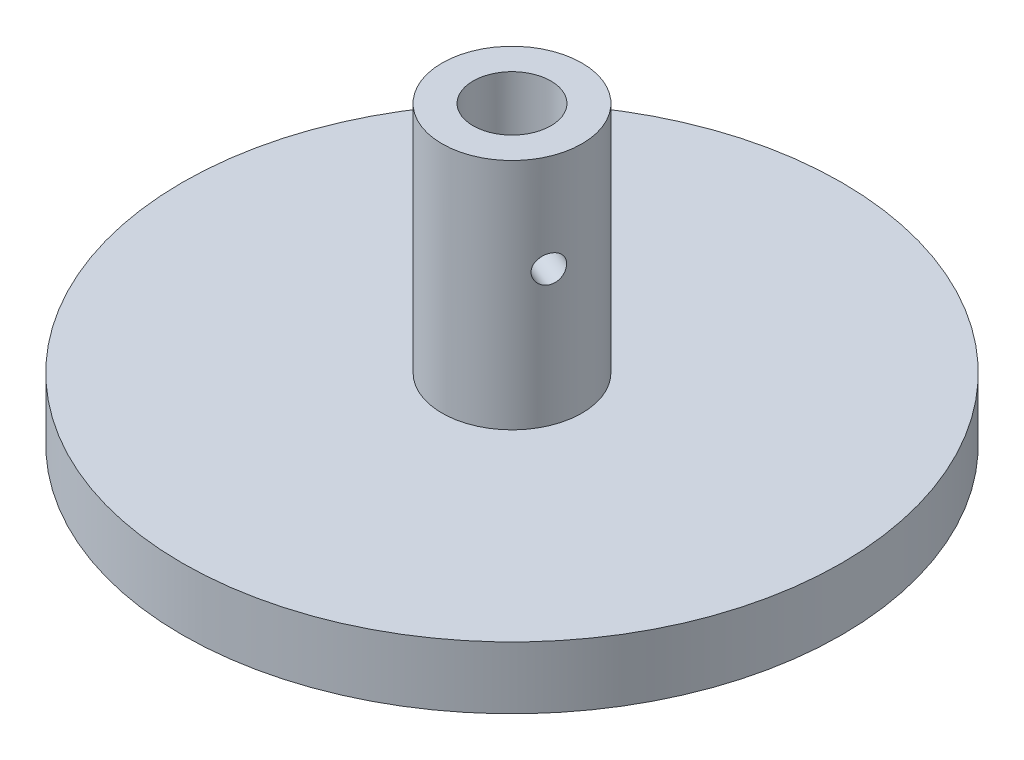
ISO-10303-21;
HEADER;
FILE_DESCRIPTION(('STEP AP214'),'2;1');
FILE_NAME('part.step','',(''),(''),'','','');
FILE_SCHEMA(('AUTOMOTIVE_DESIGN { 1 0 10303 214 1 1 1 1 }'));
ENDSEC;
DATA;
#1=APPLICATION_CONTEXT('core data for automotive mechanical design processes');
#2=APPLICATION_PROTOCOL_DEFINITION('international standard','automotive_design',2000,#1);
#3=PRODUCT_CONTEXT('',#1,'mechanical');
#4=PRODUCT('Part','Part','',(#3));
#5=PRODUCT_RELATED_PRODUCT_CATEGORY('part','',(#4));
#6=PRODUCT_DEFINITION_FORMATION('','',#4);
#7=PRODUCT_DEFINITION_CONTEXT('part definition',#1,'design');
#8=PRODUCT_DEFINITION('design','',#6,#7);
#9=PRODUCT_DEFINITION_SHAPE('','',#8);
#10=(LENGTH_UNIT() NAMED_UNIT(*) SI_UNIT(.MILLI.,.METRE.));
#11=(NAMED_UNIT(*) PLANE_ANGLE_UNIT() SI_UNIT($,.RADIAN.));
#12=(NAMED_UNIT(*) SI_UNIT($,.STERADIAN.) SOLID_ANGLE_UNIT());
#13=UNCERTAINTY_MEASURE_WITH_UNIT(LENGTH_MEASURE(1.E-05),#10,'distance_accuracy_value','');
#14=(GEOMETRIC_REPRESENTATION_CONTEXT(3) GLOBAL_UNCERTAINTY_ASSIGNED_CONTEXT((#13)) GLOBAL_UNIT_ASSIGNED_CONTEXT((#10,
#11,#12)) REPRESENTATION_CONTEXT('',''));
#15=CARTESIAN_POINT('',(0.,0.,0.));
#16=DIRECTION('',(0.,0.,1.));
#17=DIRECTION('',(1.,0.,0.));
#18=AXIS2_PLACEMENT_3D('',#15,#16,#17);
#19=CARTESIAN_POINT('',(-10.4544123734238,15.,0.));
#20=DIRECTION('',(0.,1.,0.));
#21=DIRECTION('',(0.,0.,1.));
#22=AXIS2_PLACEMENT_3D('',#19,#20,#21);
#23=PLANE('',#22);
#24=CARTESIAN_POINT('',(-10.4544123734238,15.,0.));
#25=DIRECTION('',(0.,1.,0.));
#26=DIRECTION('',(0.,0.,1.));
#27=AXIS2_PLACEMENT_3D('',#24,#25,#26);
#28=CIRCLE('',#27,4.5);
#29=CARTESIAN_POINT('',(-10.4544123734238,15.,4.5));
#30=VERTEX_POINT('',#29);
#31=EDGE_CURVE('E45',#30,#30,#28,.T.);
#32=ORIENTED_EDGE('',*,*,#31,.T.);
#33=EDGE_LOOP('',(#32));
#34=FACE_BOUND('',#33,.T.);
#35=CARTESIAN_POINT('',(-10.4544123734238,15.,0.));
#36=DIRECTION('',(0.,1.,0.));
#37=DIRECTION('',(0.,0.,1.));
#38=AXIS2_PLACEMENT_3D('',#35,#36,#37);
#39=CIRCLE('',#38,2.5);
#40=CARTESIAN_POINT('',(-10.4544123734238,15.,2.5));
#41=VERTEX_POINT('',#40);
#42=EDGE_CURVE('E49',#41,#41,#39,.T.);
#43=ORIENTED_EDGE('',*,*,#42,.F.);
#44=EDGE_LOOP('',(#43));
#45=FACE_BOUND('',#44,.T.);
#46=ADVANCED_FACE('F33',(#34,#45),#23,.T.);
#47=CARTESIAN_POINT('',(-10.4544123734238,15.,0.));
#48=DIRECTION('',(0.,-1.,0.));
#49=DIRECTION('',(0.,0.,-1.));
#50=AXIS2_PLACEMENT_3D('',#47,#48,#49);
#51=CYLINDRICAL_SURFACE('',#50,4.5);
#52=CARTESIAN_POINT('',(-6.71996057700668,8.72075334129941,2.51075083993555));
#53=CARTESIAN_POINT('',(-6.71995898771326,8.7694013811557,2.51074952122096));
#54=CARTESIAN_POINT('',(-6.71763952591937,8.8180727787025,2.50730911010159));
#55=CARTESIAN_POINT('',(-6.70849299009468,8.91404071127,2.49362250293919));
#56=CARTESIAN_POINT('',(-6.70166221127065,8.96133608291085,2.48337071319991));
#57=CARTESIAN_POINT('',(-6.68389666340696,9.05314959594451,2.45631253779294));
#58=CARTESIAN_POINT('',(-6.67296585936796,9.09767037220572,2.43951248412508));
#59=CARTESIAN_POINT('',(-6.64759950822875,9.18277015626844,2.39973534935751));
#60=CARTESIAN_POINT('',(-6.63316419182252,9.22334942328437,2.37675867483988));
#61=CARTESIAN_POINT('',(-6.60133597893731,9.29995952240175,2.32480940097412));
#62=CARTESIAN_POINT('',(-6.58390969201148,9.33592997603029,2.29576820468331));
#63=CARTESIAN_POINT('',(-6.54707149689319,9.40177474077911,2.23249300564404));
#64=CARTESIAN_POINT('',(-6.52765945369142,9.43164863698725,2.19825864974204));
#65=CARTESIAN_POINT('',(-6.4875692384146,9.48468525360256,2.12506662096391));
#66=CARTESIAN_POINT('',(-6.46688197162936,9.50779079895585,2.08607244097986));
#67=CARTESIAN_POINT('',(-6.42528306400736,9.54626615345794,2.00454695902164));
#68=CARTESIAN_POINT('',(-6.40437144318208,9.56163664677908,1.9620159702693));
#69=CARTESIAN_POINT('',(-6.3634110668419,9.5840181917506,1.87509644477165));
#70=CARTESIAN_POINT('',(-6.34335480195175,9.59113112404389,1.83073769569623));
#71=CARTESIAN_POINT('',(-6.3045220206221,9.59711331096889,1.74092009763115));
#72=CARTESIAN_POINT('',(-6.28574538750324,9.59598331822459,1.69546134945514));
#73=CARTESIAN_POINT('',(-6.25024432989627,9.58558939414372,1.60539217068989));
#74=CARTESIAN_POINT('',(-6.23349567779895,9.57643518557168,1.56077855920088));
#75=CARTESIAN_POINT('',(-6.20209660826441,9.55042649387255,1.47308558836715));
#76=CARTESIAN_POINT('',(-6.1874462714945,9.5335717148103,1.43000628805504));
#77=CARTESIAN_POINT('',(-6.16032935997807,9.49253737228927,1.34640112763591));
#78=CARTESIAN_POINT('',(-6.1478764283388,9.46831442728537,1.30589215610197));
#79=CARTESIAN_POINT('',(-6.12528175710511,9.41326339207543,1.22891810137438));
#80=CARTESIAN_POINT('',(-6.11514026978176,9.38243458161681,1.19245345980171));
#81=CARTESIAN_POINT('',(-6.09693214815039,9.31444377509642,1.12411713938774));
#82=CARTESIAN_POINT('',(-6.08890246824917,9.27718576660268,1.09233107165026));
#83=CARTESIAN_POINT('',(-6.07498352988944,9.19771273150072,1.03511958178443));
#84=CARTESIAN_POINT('',(-6.06909430761254,9.15549762111518,1.00969426717849));
#85=CARTESIAN_POINT('',(-6.05927095663165,9.06717946152191,0.966041364402544));
#86=CARTESIAN_POINT('',(-6.05534063047134,9.02106905213596,0.947827789392534));
#87=CARTESIAN_POINT('',(-6.04930019915883,8.92634344230372,0.919348034405841));
#88=CARTESIAN_POINT('',(-6.04718987086858,8.87772854969049,0.909080880186223));
#89=CARTESIAN_POINT('',(-6.044713540953,8.78021711215485,0.896991700637068));
#90=CARTESIAN_POINT('',(-6.04431985214237,8.73133786958349,0.895035641369263));
#91=CARTESIAN_POINT('',(-6.04518280548651,8.6339513097579,0.899277010889952));
#92=CARTESIAN_POINT('',(-6.04643935949635,8.58544397277815,0.905474004196917));
#93=CARTESIAN_POINT('',(-6.05064091632443,8.49062522299962,0.925689401107161));
#94=CARTESIAN_POINT('',(-6.05357065168352,8.44429799946459,0.939637050822785));
#95=CARTESIAN_POINT('',(-6.06122515029049,8.35464639639351,0.974796264644591));
#96=CARTESIAN_POINT('',(-6.0659500544412,8.31132225288495,0.996008398927335));
#97=CARTESIAN_POINT('',(-6.0774220315276,8.22831700064969,1.04527543425734));
#98=CARTESIAN_POINT('',(-6.08419338200466,8.18868755169872,1.07341168909652));
#99=CARTESIAN_POINT('',(-6.09990403247331,8.11473644637039,1.13546426402845));
#100=CARTESIAN_POINT('',(-6.10884354283519,8.08041530557239,1.16938114490368));
#101=CARTESIAN_POINT('',(-6.12916745745974,8.01754911126578,1.24246237979493));
#102=CARTESIAN_POINT('',(-6.14058531768422,7.98909466948293,1.28169546584053));
#103=CARTESIAN_POINT('',(-6.16583366209912,7.93941084548362,1.36379409559957));
#104=CARTESIAN_POINT('',(-6.17966404862022,7.91818117088048,1.4066594922255));
#105=CARTESIAN_POINT('',(-6.20956219261586,7.88368320369586,1.49445087978476));
#106=CARTESIAN_POINT('',(-6.2256171273282,7.87037144612582,1.53936413597049));
#107=CARTESIAN_POINT('',(-6.25975513708717,7.85194900380323,1.63009138143818));
#108=CARTESIAN_POINT('',(-6.27783798160948,7.84683738790188,1.67590526785297));
#109=CARTESIAN_POINT('',(-6.31526506683686,7.8449947472039,1.76629944274297));
#110=CARTESIAN_POINT('',(-6.3345836568633,7.84812721194876,1.81088762545327));
#111=CARTESIAN_POINT('',(-6.3741426023601,7.8623834998134,1.89834205108954));
#112=CARTESIAN_POINT('',(-6.39438294751541,7.87350723352611,1.94120831327485));
#113=CARTESIAN_POINT('',(-6.435014974249,7.90337103026422,2.02399813519337));
#114=CARTESIAN_POINT('',(-6.45540626360012,7.92209553364606,2.06392751099102));
#115=CARTESIAN_POINT('',(-6.49557693582779,7.96661250671628,2.13997043106444));
#116=CARTESIAN_POINT('',(-6.51535627350836,7.99240549707099,2.17608369397288));
#117=CARTESIAN_POINT('',(-6.55375481638532,8.05079201585269,2.24419799344549));
#118=CARTESIAN_POINT('',(-6.57235161473877,8.08348364542611,2.27612758037688));
#119=CARTESIAN_POINT('',(-6.60718085908096,8.15453695993686,2.33451673029753));
#120=CARTESIAN_POINT('',(-6.62341274603968,8.19289998120338,2.3609750005664));
#121=CARTESIAN_POINT('',(-6.652839959348,8.27467028789462,2.40807565504078));
#122=CARTESIAN_POINT('',(-6.66600304169605,8.31812450406024,2.42865675282003));
#123=CARTESIAN_POINT('',(-6.68834433939102,8.40852844224606,2.46316006116111));
#124=CARTESIAN_POINT('',(-6.6975262355149,8.45547488829142,2.47708842367706));
#125=CARTESIAN_POINT('',(-6.70956724178396,8.538910943496,2.49523905423484));
#126=CARTESIAN_POINT('',(-6.7134525138314,8.57491882965933,2.5010480198961));
#127=CARTESIAN_POINT('',(-6.7186497396202,8.64753119212529,2.50880434908633));
#128=CARTESIAN_POINT('',(-6.71996177327802,8.68413564986473,2.51075183254047));
#129=CARTESIAN_POINT('',(-6.71996057700668,8.72075334129941,2.51075083993555));
#130=B_SPLINE_CURVE_WITH_KNOTS('',3,(#52,#53,#54,#55,#56,#57,#58,#59,#60,#61,#62,#63,#64,#65,
#66,#67,#68,#69,#70,#71,#72,#73,#74,#75,#76,#77,#78,#79,#80,#81,#82,#83,#84,#85,#86,#87,#88,#89,
#90,#91,#92,#93,#94,#95,#96,#97,#98,#99,#100,#101,#102,#103,#104,#105,#106,#107,#108,#109,#110,
#111,#112,#113,#114,#115,#116,#117,#118,#119,#120,#121,#122,#123,#124,#125,#126,#127,#128,#129),
.UNSPECIFIED.,.T.,.F.,(4,2,2,2,2,2,2,2,2,2,2,2,2,2,2,2,2,2,2,2,2,2,2,2,2,2,2,2,2,2,2,2,2,2,2,2,
2,2,4),(0.,0.145810077769049,0.291740047137747,0.437529254726644,0.583308867947869,
0.730836617899612,0.87837440477063,1.02712476086778,1.17586195754795,1.32274386934314,
1.46961237018691,1.61450338728531,1.75939997305608,1.90516674417091,2.05094941666395,
2.19913498083811,2.34732304977728,2.49579766686074,2.64425407785192,2.79030700721842,
2.93635213573115,3.08108544953129,3.22583012579809,3.37236425321235,3.51891260410213,
3.6675781656088,3.81623770989706,3.96407347818473,4.1118924581228,4.25727922274166,
4.40266436078491,4.5477533678171,4.69285306501186,4.84017497932035,4.98753166204101,
5.13637309588672,5.28507662450311,5.39483221339293,5.50458439357503),.UNSPECIFIED.);
#131=CARTESIAN_POINT('',(-6.71996057700668,8.72075334129941,2.51075083993555));
#132=VERTEX_POINT('',#131);
#133=EDGE_CURVE('E38',#132,#132,#130,.T.);
#134=ORIENTED_EDGE('',*,*,#133,.T.);
#135=EDGE_LOOP('',(#134));
#136=FACE_BOUND('',#135,.T.);
#137=CARTESIAN_POINT('',(-14.8642420861433,8.72075334129941,-0.896326896180082));
#138=CARTESIAN_POINT('',(-14.8642422630035,8.67210530144312,-0.896328953747144));
#139=CARTESIAN_POINT('',(-14.8634210045145,8.62343390389632,-0.900396123054885));
#140=CARTESIAN_POINT('',(-14.8600972060835,8.52746597132881,-0.916518613470455));
#141=CARTESIAN_POINT('',(-14.8575932842715,8.48017059968796,-0.928580500045977));
#142=CARTESIAN_POINT('',(-14.8507996321938,8.3883570866543,-0.960228657001771));
#143=CARTESIAN_POINT('',(-14.8465116268208,8.34383631039309,-0.979807658255741));
#144=CARTESIAN_POINT('',(-14.8359979192936,8.25873652633037,-1.02579824614573));
#145=CARTESIAN_POINT('',(-14.8297723446774,8.21815725931445,-1.05220938304546));
#146=CARTESIAN_POINT('',(-14.8151282833769,8.14154716019707,-1.11134747279539));
#147=CARTESIAN_POINT('',(-14.8066843953132,8.10557670656852,-1.14414636473385));
#148=CARTESIAN_POINT('',(-14.7874931503555,8.0397319418197,-1.21480398675728));
#149=CARTESIAN_POINT('',(-14.7767456367862,8.00985804561156,-1.25266306093203));
#150=CARTESIAN_POINT('',(-14.7527762799416,7.95682142899625,-1.3325990876663));
#151=CARTESIAN_POINT('',(-14.739534826849,7.93371588364297,-1.37470814844505));
#152=CARTESIAN_POINT('',(-14.710690803951,7.89524052914087,-1.4615695073276));
#153=CARTESIAN_POINT('',(-14.6950884431289,7.87987003581973,-1.506321571264));
#154=CARTESIAN_POINT('',(-14.6619551992341,7.85748849084821,-1.59651549839701));
#155=CARTESIAN_POINT('',(-14.6444507993057,7.85037555855492,-1.64194179435018));
#156=CARTESIAN_POINT('',(-14.6077601276567,7.84439337162992,-1.73265552231858));
#157=CARTESIAN_POINT('',(-14.5885740096442,7.84552336437423,-1.77794296663399));
#158=CARTESIAN_POINT('',(-14.5493649411746,7.85591728845509,-1.8664609365859));
#159=CARTESIAN_POINT('',(-14.5293567363017,7.86507149702714,-1.90971094716317));
#160=CARTESIAN_POINT('',(-14.4889596070472,7.89108018872627,-1.99363967078789));
#161=CARTESIAN_POINT('',(-14.4685706680628,7.90793496778851,-2.03431828494743));
#162=CARTESIAN_POINT('',(-14.4280777464623,7.94896931030955,-2.11232772693464));
#163=CARTESIAN_POINT('',(-14.4079762105324,7.97319225531344,-2.14963698227976));
#164=CARTESIAN_POINT('',(-14.3690299172078,8.02824329052338,-2.21977050141037));
#165=CARTESIAN_POINT('',(-14.3501852971516,8.059072100982,-2.25259427549395));
#166=CARTESIAN_POINT('',(-14.3143097484085,8.12706290750239,-2.31353960659851));
#167=CARTESIAN_POINT('',(-14.2973138339411,8.16432091599613,-2.34157474085796));
#168=CARTESIAN_POINT('',(-14.2663483611073,8.24379395109809,-2.3916549855649));
#169=CARTESIAN_POINT('',(-14.2523788538999,8.28600906148363,-2.41369999475565));
#170=CARTESIAN_POINT('',(-14.2281923713748,8.37432722107691,-2.45134422682807));
#171=CARTESIAN_POINT('',(-14.2179827044824,8.42043763046285,-2.46693090319986));
#172=CARTESIAN_POINT('',(-14.2019444099107,8.51516324029509,-2.49122815328652));
#173=CARTESIAN_POINT('',(-14.1961152451778,8.56377813290832,-2.49993956992098));
#174=CARTESIAN_POINT('',(-14.1892456593368,8.66128957044397,-2.51019087532052));
#175=CARTESIAN_POINT('',(-14.1881292372446,8.71016881301532,-2.51184458643521));
#176=CARTESIAN_POINT('',(-14.1905434659306,8.80755537284091,-2.50825217725239));
#177=CARTESIAN_POINT('',(-14.1940738685065,8.85606270982066,-2.50300642547805));
#178=CARTESIAN_POINT('',(-14.2055185231478,8.95088145959919,-2.48582110522615));
#179=CARTESIAN_POINT('',(-14.2133931135192,8.99720868313422,-2.47394208555504));
#180=CARTESIAN_POINT('',(-14.2330543407674,9.0868602862053,-2.44380576513286));
#181=CARTESIAN_POINT('',(-14.2448412847156,9.13018442971386,-2.4255479637202));
#182=CARTESIAN_POINT('',(-14.2718678563374,9.21318968194912,-2.38278803557658));
#183=CARTESIAN_POINT('',(-14.2871483673831,9.2528191309001,-2.35821150193489));
#184=CARTESIAN_POINT('',(-14.3203030079661,9.32677023622842,-2.30345644370605));
#185=CARTESIAN_POINT('',(-14.3381773891115,9.36109137702642,-2.27327737558784));
#186=CARTESIAN_POINT('',(-14.3759460838198,9.42395757133303,-2.20749398787539));
#187=CARTESIAN_POINT('',(-14.3958658489533,9.45241201311588,-2.1718175876955));
#188=CARTESIAN_POINT('',(-14.4365979763029,9.50209583711519,-2.0961964418064));
#189=CARTESIAN_POINT('',(-14.4574103023587,9.52332551171834,-2.05625186891635));
#190=CARTESIAN_POINT('',(-14.4989313338997,9.55782347890295,-1.97332279871936));
#191=CARTESIAN_POINT('',(-14.5196399745066,9.57113523647299,-1.93035637329163));
#192=CARTESIAN_POINT('',(-14.560274645143,9.58955767879558,-1.84234694014537));
#193=CARTESIAN_POINT('',(-14.5802007637794,9.59466929469693,-1.79730416879931));
#194=CARTESIAN_POINT('',(-14.6182889556877,9.59651193539491,-1.7071865611978));
#195=CARTESIAN_POINT('',(-14.6364746598956,9.59337947065006,-1.66212444717194));
#196=CARTESIAN_POINT('',(-14.6709727529233,9.57912318278542,-1.5725528651292));
#197=CARTESIAN_POINT('',(-14.6872851626993,9.5679994490727,-1.52804339093499));
#198=CARTESIAN_POINT('',(-14.7177083374006,9.5381356523346,-1.44098279909875));
#199=CARTESIAN_POINT('',(-14.7318235191182,9.51941114895275,-1.39842787719695));
#200=CARTESIAN_POINT('',(-14.7577663997296,9.47489417588253,-1.31643290450897));
#201=CARTESIAN_POINT('',(-14.7695939300048,9.44910118552782,-1.2769930834576));
#202=CARTESIAN_POINT('',(-14.7911353740718,9.39071466674612,-1.20182678731879));
#203=CARTESIAN_POINT('',(-14.8008141434287,9.35802303717271,-1.16616643322151));
#204=CARTESIAN_POINT('',(-14.8179367300842,9.28696972266195,-1.10036988227748));
#205=CARTESIAN_POINT('',(-14.8253800193882,9.24860670139544,-1.07023499113454));
#206=CARTESIAN_POINT('',(-14.8382573383252,9.16683639470419,-1.01621085586145));
#207=CARTESIAN_POINT('',(-14.8436703671889,9.12338217853858,-0.992387601650065));
#208=CARTESIAN_POINT('',(-14.8525527162279,9.03297824035276,-0.952253878364963));
#209=CARTESIAN_POINT('',(-14.85602383265,8.9860317943074,-0.935936468963056));
#210=CARTESIAN_POINT('',(-14.8604940432686,8.90259573910282,-0.914618672673508));
#211=CARTESIAN_POINT('',(-14.8619024815502,8.86658785293949,-0.90777354867586));
#212=CARTESIAN_POINT('',(-14.8637764217839,8.79397549047353,-0.898626956610637));
#213=CARTESIAN_POINT('',(-14.8642419530196,8.75737103273408,-0.896325347436165));
#214=CARTESIAN_POINT('',(-14.8642420861433,8.72075334129941,-0.896326896180082));
#215=B_SPLINE_CURVE_WITH_KNOTS('',3,(#137,#138,#139,#140,#141,#142,#143,#144,#145,#146,#147,
#148,#149,#150,#151,#152,#153,#154,#155,#156,#157,#158,#159,#160,#161,#162,#163,#164,#165,#166,
#167,#168,#169,#170,#171,#172,#173,#174,#175,#176,#177,#178,#179,#180,#181,#182,#183,#184,#185,
#186,#187,#188,#189,#190,#191,#192,#193,#194,#195,#196,#197,#198,#199,#200,#201,#202,#203,#204,
#205,#206,#207,#208,#209,#210,#211,#212,#213,#214),.UNSPECIFIED.,.T.,.F.,(4,2,2,2,2,2,2,2,2,2,2,
2,2,2,2,2,2,2,2,2,2,2,2,2,2,2,2,2,2,2,2,2,2,2,2,2,2,2,4),(0.,0.145810077769049,
0.291740047137747,0.437529254726645,0.583308867947869,0.730836617899612,0.878374404770631,
1.02712476086778,1.17586195754795,1.32274386934314,1.46961237018691,1.61450338728531,
1.75939997305608,1.90516674417091,2.05094941666395,2.19913498083811,2.34732304977728,
2.49579766686074,2.64425407785192,2.79030700721842,2.93635213573115,3.08108544953129,
3.22583012579809,3.37236425321235,3.51891260410214,3.6675781656088,3.81623770989706,
3.96407347818473,4.1118924581228,4.25727922274167,4.40266436078491,4.54775336781711,
4.69285306501186,4.84017497932035,4.98753166204101,5.13637309588672,5.28507662450311,
5.39483221339293,5.50458439357503),.UNSPECIFIED.);
#216=CARTESIAN_POINT('',(-14.8642420861433,8.72075334129941,-0.896326896180082));
#217=VERTEX_POINT('',#216);
#218=EDGE_CURVE('E10',#217,#217,#215,.T.);
#219=ORIENTED_EDGE('',*,*,#218,.T.);
#220=EDGE_LOOP('',(#219));
#221=FACE_BOUND('',#220,.T.);
#222=ORIENTED_EDGE('',*,*,#31,.F.);
#223=EDGE_LOOP('',(#222));
#224=FACE_BOUND('',#223,.T.);
#225=CARTESIAN_POINT('',(-10.4544123734238,0.,0.));
#226=DIRECTION('',(0.,-1.,0.));
#227=DIRECTION('',(0.,0.,-1.));
#228=AXIS2_PLACEMENT_3D('',#225,#226,#227);
#229=CIRCLE('',#228,4.5);
#230=CARTESIAN_POINT('',(-10.4544123734238,0.,-4.5));
#231=VERTEX_POINT('',#230);
#232=EDGE_CURVE('E95',#231,#231,#229,.T.);
#233=ORIENTED_EDGE('',*,*,#232,.F.);
#234=EDGE_LOOP('',(#233));
#235=FACE_BOUND('',#234,.T.);
#236=ADVANCED_FACE('F35',(#136,#221,#224,#235),#51,.T.);
#237=CARTESIAN_POINT('',(-10.4544123734238,15.,0.));
#238=DIRECTION('',(0.,-1.,0.));
#239=DIRECTION('',(0.,0.,-1.));
#240=AXIS2_PLACEMENT_3D('',#237,#238,#239);
#241=CYLINDRICAL_SURFACE('',#240,2.5);
#242=CARTESIAN_POINT('',(-8.63165683929229,8.72075334129941,1.71101205805014));
#243=CARTESIAN_POINT('',(-8.63165773086769,8.76825714839585,1.71101251337566));
#244=CARTESIAN_POINT('',(-8.62881090044094,8.81575563282845,1.70799518268383));
#245=CARTESIAN_POINT('',(-8.61766350240887,8.90933564798091,1.69600099397015));
#246=CARTESIAN_POINT('',(-8.60936248166385,8.95541706063597,1.68702364078291));
#247=CARTESIAN_POINT('',(-8.58797522182576,9.04479001221512,1.66332916738711));
#248=CARTESIAN_POINT('',(-8.57489915321475,9.08808725237926,1.6486242420616));
#249=CARTESIAN_POINT('',(-8.54485654864352,9.170960033147,1.61373008754518));
#250=CARTESIAN_POINT('',(-8.52788902366789,9.21053462402587,1.59353946392027));
#251=CARTESIAN_POINT('',(-8.49035574014704,9.28654799549608,1.54706375127783));
#252=CARTESIAN_POINT('',(-8.46967491728443,9.322802802259,1.52057061277143));
#253=CARTESIAN_POINT('',(-8.42638536690972,9.38948771480745,1.46233424101214));
#254=CARTESIAN_POINT('',(-8.40377629378645,9.4199167732264,1.43059006562422));
#255=CARTESIAN_POINT('',(-8.3571353983819,9.47494087352947,1.36133016250878));
#256=CARTESIAN_POINT('',(-8.33308131949145,9.49934036381848,1.32367335662694));
#257=CARTESIAN_POINT('',(-8.28543206659003,9.54031324573653,1.2440549060037));
#258=CARTESIAN_POINT('',(-8.26183675736253,9.55688897790137,1.20209455327898));
#259=CARTESIAN_POINT('',(-8.21712253889298,9.58111173566851,1.11658947426401));
#260=CARTESIAN_POINT('',(-8.19594356154712,9.58907452756242,1.07316580076122));
#261=CARTESIAN_POINT('',(-8.15592999376552,9.59685238512921,0.984550370005018));
#262=CARTESIAN_POINT('',(-8.13709473992694,9.59666976168818,0.939359117855707));
#263=CARTESIAN_POINT('',(-8.10310267127953,9.58835593721302,0.85059142344742));
#264=CARTESIAN_POINT('',(-8.08782213038959,9.58056833371483,0.8070295241071));
#265=CARTESIAN_POINT('',(-8.0601690590717,9.55783758431876,0.720865707658206));
#266=CARTESIAN_POINT('',(-8.04779673026564,9.54289394252173,0.678263857293366));
#267=CARTESIAN_POINT('',(-8.02577956503301,9.50609101549657,0.594674794305338));
#268=CARTESIAN_POINT('',(-8.0161746590518,9.48413927829867,0.553717917569004));
#269=CARTESIAN_POINT('',(-7.99966280288267,9.43402147796841,0.475201628006846));
#270=CARTESIAN_POINT('',(-7.9927566557552,9.40585356900667,0.437643229005352));
#271=CARTESIAN_POINT('',(-7.98093757304478,9.34240030457486,0.365158293392849));
#272=CARTESIAN_POINT('',(-7.97614578210025,9.30682283253875,0.330467338466446));
#273=CARTESIAN_POINT('',(-7.96852266827211,9.23042734535778,0.267154837462362));
#274=CARTESIAN_POINT('',(-7.96569171528474,9.18960834316125,0.238534437251834));
#275=CARTESIAN_POINT('',(-7.96136107955433,9.10297332402144,0.188019769513981));
#276=CARTESIAN_POINT('',(-7.95988503236312,9.05708368554721,0.166249119927188));
#277=CARTESIAN_POINT('',(-7.95779184585372,8.96216800417221,0.131144490701802));
#278=CARTESIAN_POINT('',(-7.95717430162828,8.91314345125326,0.117806535458176));
#279=CARTESIAN_POINT('',(-7.95642797426916,8.81592915390692,0.100717149068067));
#280=CARTESIAN_POINT('',(-7.95627666748508,8.76781674189808,0.0965268991295084));
#281=CARTESIAN_POINT('',(-7.95628122956256,8.67160855117155,0.0966506496711007));
#282=CARTESIAN_POINT('',(-7.95643703502861,8.62351277107041,0.100962895027127));
#283=CARTESIAN_POINT('',(-7.95716335183382,8.53067381170913,0.117518062171183));
#284=CARTESIAN_POINT('',(-7.95771735895987,8.4858731245679,0.129443313813441));
#285=CARTESIAN_POINT('',(-7.95951353054759,8.39880257406002,0.160368289406187));
#286=CARTESIAN_POINT('',(-7.96075582466716,8.35653318919715,0.179369346059269));
#287=CARTESIAN_POINT('',(-7.96440234168968,8.2741259802568,0.22444726056411));
#288=CARTESIAN_POINT('',(-7.96684473440904,8.23410995920683,0.250743268894971));
#289=CARTESIAN_POINT('',(-7.97342712825905,8.15872622915843,0.30915157503541));
#290=CARTESIAN_POINT('',(-7.97756767872414,8.1233600292169,0.34126575307732));
#291=CARTESIAN_POINT('',(-7.98835030066463,8.05630651994336,0.412176993012902));
#292=CARTESIAN_POINT('',(-7.99511518704771,8.02492029313832,0.451240982868229));
#293=CARTESIAN_POINT('',(-8.01163395988324,7.96905289063479,0.533469539524167));
#294=CARTESIAN_POINT('',(-8.02138777688205,7.94457155451304,0.57663401102598));
#295=CARTESIAN_POINT('',(-8.04416697096315,7.9034147760773,0.665435154344294));
#296=CARTESIAN_POINT('',(-8.05717350823166,7.8866959137179,0.711056441677047));
#297=CARTESIAN_POINT('',(-8.08654890846928,7.86149694605747,0.803473118019355));
#298=CARTESIAN_POINT('',(-8.10291641497627,7.85301352488055,0.850268026696273));
#299=CARTESIAN_POINT('',(-8.13780332898358,7.84484823814852,0.941044921042056));
#300=CARTESIAN_POINT('',(-8.15616872864444,7.84473605918137,0.985047778388921));
#301=CARTESIAN_POINT('',(-8.195120688658,7.85223736536129,1.07137428920736));
#302=CARTESIAN_POINT('',(-8.2157070365068,7.85985011195989,1.11369810280348));
#303=CARTESIAN_POINT('',(-8.25790869628367,7.88229201426594,1.19474762271706));
#304=CARTESIAN_POINT('',(-8.27949703255912,7.89698133625765,1.2335264072142));
#305=CARTESIAN_POINT('',(-8.32317101444006,7.93302651876053,1.30753921125032));
#306=CARTESIAN_POINT('',(-8.34525675179261,7.9543836186633,1.34277257016223));
#307=CARTESIAN_POINT('',(-8.38982108839185,8.00411693703986,1.41037821907126));
#308=CARTESIAN_POINT('',(-8.41228119385935,8.03273531154691,1.44258439849301));
#309=CARTESIAN_POINT('',(-8.45559244105727,8.09577900770602,1.50202323456444));
#310=CARTESIAN_POINT('',(-8.47644304017956,8.13020627533935,1.52925421813337));
#311=CARTESIAN_POINT('',(-8.51627474756449,8.20571261385303,1.57946068672262));
#312=CARTESIAN_POINT('',(-8.53513189995589,8.24701900782098,1.60219382096087));
#313=CARTESIAN_POINT('',(-8.56860679321023,8.33406526987867,1.6414646264747));
#314=CARTESIAN_POINT('',(-8.58322508269571,8.37980456320905,1.65800309958645));
#315=CARTESIAN_POINT('',(-8.60697087220781,8.47395441553334,1.68442115303654));
#316=CARTESIAN_POINT('',(-8.61615743478489,8.52232974793455,1.69437250696688));
#317=CARTESIAN_POINT('',(-8.62849859462715,8.62072363263312,1.70766623584502));
#318=CARTESIAN_POINT('',(-8.63165590064364,8.67074143674199,1.71101157868444));
#319=CARTESIAN_POINT('',(-8.63165683929229,8.72075334129941,1.71101205805014));
#320=B_SPLINE_CURVE_WITH_KNOTS('',3,(#242,#243,#244,#245,#246,#247,#248,#249,#250,#251,#252,
#253,#254,#255,#256,#257,#258,#259,#260,#261,#262,#263,#264,#265,#266,#267,#268,#269,#270,#271,
#272,#273,#274,#275,#276,#277,#278,#279,#280,#281,#282,#283,#284,#285,#286,#287,#288,#289,#290,
#291,#292,#293,#294,#295,#296,#297,#298,#299,#300,#301,#302,#303,#304,#305,#306,#307,#308,#309,
#310,#311,#312,#313,#314,#315,#316,#317,#318,#319),.UNSPECIFIED.,.T.,.F.,(4,2,2,2,2,2,2,2,2,2,2,
2,2,2,2,2,2,2,2,2,2,2,2,2,2,2,2,2,2,2,2,2,2,2,2,2,2,2,4),(0.,0.142325817777233,
0.284663461623968,0.426699688913543,0.568772054855808,0.716419080131461,0.864092624857612,
1.01606374319633,1.16798936937711,1.31413368268415,1.46023653454357,1.60002997822141,
1.73983311070771,1.88156255898653,2.02333414915623,2.17241627472203,2.321526515772,
2.47319103471841,2.62478399780065,2.76892869589096,2.91304364208587,3.05150647182531,
3.18999539374508,3.33320583614617,3.47646264205885,3.62744183282783,3.77841751556571,
3.92853821549842,4.07859844650001,4.22093940608962,4.36326675832541,4.50289038880624,
4.64253998768174,4.78765927265438,4.93282726951352,5.08443473322386,5.23602256609578,
5.38593024135788,5.53577055205721),.UNSPECIFIED.);
#321=CARTESIAN_POINT('',(-8.63165683929229,8.72075334129941,1.71101205805014));
#322=VERTEX_POINT('',#321);
#323=EDGE_CURVE('E72',#322,#322,#320,.T.);
#324=ORIENTED_EDGE('',*,*,#323,.F.);
#325=EDGE_LOOP('',(#324));
#326=FACE_BOUND('',#325,.T.);
#327=CARTESIAN_POINT('',(-12.9525458238577,8.72075334129941,-0.09658811429468));
#328=CARTESIAN_POINT('',(-12.952545522089,8.67324953420297,-0.0965871597457381));
#329=CARTESIAN_POINT('',(-12.9523957972645,8.62575104977036,-0.100732797267213));
#330=CARTESIAN_POINT('',(-12.9516819439571,8.53217103461791,-0.117091753812186));
#331=CARTESIAN_POINT('',(-12.9511177810418,8.48608962196284,-0.129305743163035));
#332=CARTESIAN_POINT('',(-12.9492621571416,8.39671667038369,-0.16117107876189));
#333=CARTESIAN_POINT('',(-12.9479722388251,8.35341943021956,-0.180806620768289));
#334=CARTESIAN_POINT('',(-12.9442187912255,8.27054664945181,-0.226698578015254));
#335=CARTESIAN_POINT('',(-12.9417549634211,8.23097205857295,-0.252956676550968));
#336=CARTESIAN_POINT('',(-12.935014041548,8.15495868710273,-0.312314062020508));
#337=CARTESIAN_POINT('',(-12.930669591626,8.11870388033981,-0.345641356796259));
#338=CARTESIAN_POINT('',(-12.9195959063449,8.05201896779136,-0.417354909641067));
#339=CARTESIAN_POINT('',(-12.9128662427854,8.02158990937241,-0.455742075294816));
#340=CARTESIAN_POINT('',(-12.8962961420326,7.96656580906935,-0.537581790987996));
#341=CARTESIAN_POINT('',(-12.8863708750378,7.94216631878033,-0.581149242320065));
#342=CARTESIAN_POINT('',(-12.8631328207862,7.90119343686229,-0.670979870817862));
#343=CARTESIAN_POINT('',(-12.8498210484642,7.88461770469744,-0.717242237121063));
#344=CARTESIAN_POINT('',(-12.8203306109056,7.8603949469303,-0.809116030790977));
#345=CARTESIAN_POINT('',(-12.8042803176239,7.85243215503639,-0.854685237361484));
#346=CARTESIAN_POINT('',(-12.7692747133963,7.8446542974696,-0.945395698981852));
#347=CARTESIAN_POINT('',(-12.7503202279018,7.84483692091064,-0.990537071774732));
#348=CARTESIAN_POINT('',(-12.7109784132827,7.85315074538579,-1.07706675410377));
#349=CARTESIAN_POINT('',(-12.6906883096549,7.86093834888398,-1.11853295357754));
#350=CARTESIAN_POINT('',(-12.6487499102986,7.88366909828005,-1.19872064763207));
#351=CARTESIAN_POINT('',(-12.6271015205339,7.89861274007708,-1.23744195178354));
#352=CARTESIAN_POINT('',(-12.5830394493695,7.93541566710225,-1.31180875150492));
#353=CARTESIAN_POINT('',(-12.5606193332359,7.95736740430014,-1.34740451478456));
#354=CARTESIAN_POINT('',(-12.5163040317642,8.0074852046304,-1.41428951441998));
#355=CARTESIAN_POINT('',(-12.4944090044914,8.03565311359214,-1.44557746712426));
#356=CARTESIAN_POINT('',(-12.4510935363246,8.09910637802395,-1.50488620867515));
#357=CARTESIAN_POINT('',(-12.4297557868495,8.13468385006007,-1.53265532932202));
#358=CARTESIAN_POINT('',(-12.3900256132101,8.21107933724103,-1.58253616682919));
#359=CARTESIAN_POINT('',(-12.3716337452654,8.25189833943756,-1.60464681576879));
#360=CARTESIAN_POINT('',(-12.3387047330165,8.33853335857737,-1.6431976421517));
#361=CARTESIAN_POINT('',(-12.3242390175665,8.3844229970516,-1.65953419549878));
#362=CARTESIAN_POINT('',(-12.3007119734303,8.4793386784266,-1.6856721873311));
#363=CARTESIAN_POINT('',(-12.291648098155,8.52836323134555,-1.69547670547049));
#364=CARTESIAN_POINT('',(-12.2800033886882,8.6255775286919,-1.708006864015));
#365=CARTESIAN_POINT('',(-12.277125902134,8.67368994070074,-1.71105664424008));
#366=CARTESIAN_POINT('',(-12.2772108171944,8.76989813142726,-1.71096650855556));
#367=CARTESIAN_POINT('',(-12.2801720135611,8.8179939115284,-1.70782787008777));
#368=CARTESIAN_POINT('',(-12.2914503750592,8.91083287088968,-1.69568704403731));
#369=CARTESIAN_POINT('',(-12.2995529269401,8.95563355803091,-1.68691964968982));
#370=CARTESIAN_POINT('',(-12.3203123337297,9.04270410853879,-1.66392775160535));
#371=CARTESIAN_POINT('',(-12.3329700465716,9.08497349340166,-1.64970221983237));
#372=CARTESIAN_POINT('',(-12.3625080791639,9.16738070234201,-1.61545575880231));
#373=CARTESIAN_POINT('',(-12.3795176482071,9.20739672339198,-1.59525378124329));
#374=CARTESIAN_POINT('',(-12.4164864325855,9.28278045344038,-1.54955731402124));
#375=CARTESIAN_POINT('',(-12.4364466010679,9.31814665338192,-1.52406111305691));
#376=CARTESIAN_POINT('',(-12.4793692143469,9.38520016265545,-1.46659531318936));
#377=CARTESIAN_POINT('',(-12.5024354983603,9.4165863894605,-1.4343508480363));
#378=CARTESIAN_POINT('',(-12.5493893111159,9.47245379196402,-1.36485448227935));
#379=CARTESIAN_POINT('',(-12.5732768207638,9.49693512808577,-1.3276026980416));
#380=CARTESIAN_POINT('',(-12.6205151884185,9.53809190652151,-1.2490338024216));
#381=CARTESIAN_POINT('',(-12.6438683194346,9.55481076888091,-1.20774090785897));
#382=CARTESIAN_POINT('',(-12.6890498740108,9.58000973654134,-1.12193657620049));
#383=CARTESIAN_POINT('',(-12.7108789079372,9.58849315771826,-1.07742644224004));
#384=CARTESIAN_POINT('',(-12.7510231142638,9.59665844445029,-0.988848882923772));
#385=CARTESIAN_POINT('',(-12.7694612799335,9.59677062341745,-0.944876466500192));
#386=CARTESIAN_POINT('',(-12.8035824007312,9.58926931723752,-0.856529022991657));
#387=CARTESIAN_POINT('',(-12.8192656190802,9.58165657063892,-0.812154034796885));
#388=CARTESIAN_POINT('',(-12.8473475253228,9.55921466833287,-0.725197658906867));
#389=CARTESIAN_POINT('',(-12.859802948247,9.54452534634116,-0.682598212548982));
#390=CARTESIAN_POINT('',(-12.8818405298739,9.50848016383829,-0.599534039461761));
#391=CARTESIAN_POINT('',(-12.8914221537516,9.48712306393552,-0.559069711239392));
#392=CARTESIAN_POINT('',(-12.9082723060415,9.43738974555895,-0.479870113836714));
#393=CARTESIAN_POINT('',(-12.9154355380525,9.4087713710519,-0.441264642233407));
#394=CARTESIAN_POINT('',(-12.92735021985,9.34572767489279,-0.368691370810444));
#395=CARTESIAN_POINT('',(-12.9321008592714,9.31130040725946,-0.334725132058158));
#396=CARTESIAN_POINT('',(-12.9398845544673,9.23579406874578,-0.271111701947051));
#397=CARTESIAN_POINT('',(-12.9428320726105,9.19448767477783,-0.241722933252155));
#398=CARTESIAN_POINT('',(-12.9472921071258,9.10744141272014,-0.190314055261899));
#399=CARTESIAN_POINT('',(-12.9488048092592,9.06170211938976,-0.168292992331042));
#400=CARTESIAN_POINT('',(-12.9509438326863,8.96755226706547,-0.132835966984529));
#401=CARTESIAN_POINT('',(-12.9515797925462,8.91917693466427,-0.119307554953326));
#402=CARTESIAN_POINT('',(-12.9523808412484,8.82078304996569,-0.101186137384204));
#403=CARTESIAN_POINT('',(-12.9525461415592,8.77076524585683,-0.0965891192417253));
#404=CARTESIAN_POINT('',(-12.9525458238577,8.72075334129941,-0.09658811429468));
#405=B_SPLINE_CURVE_WITH_KNOTS('',3,(#327,#328,#329,#330,#331,#332,#333,#334,#335,#336,#337,
#338,#339,#340,#341,#342,#343,#344,#345,#346,#347,#348,#349,#350,#351,#352,#353,#354,#355,#356,
#357,#358,#359,#360,#361,#362,#363,#364,#365,#366,#367,#368,#369,#370,#371,#372,#373,#374,#375,
#376,#377,#378,#379,#380,#381,#382,#383,#384,#385,#386,#387,#388,#389,#390,#391,#392,#393,#394,
#395,#396,#397,#398,#399,#400,#401,#402,#403,#404),.UNSPECIFIED.,.T.,.F.,(4,2,2,2,2,2,2,2,2,2,2,
2,2,2,2,2,2,2,2,2,2,2,2,2,2,2,2,2,2,2,2,2,2,2,2,2,2,2,4),(0.,0.142325817777234,
0.284663461623968,0.426699688913542,0.568772054855808,0.71641908013146,0.864092624857612,
1.01606374319633,1.16798936937711,1.31413368268415,1.46023653454357,1.60002997822141,
1.73983311070771,1.88156255898653,2.02333414915623,2.17241627472203,2.32152651577201,
2.47319103471841,2.62478399780065,2.76892869589096,2.91304364208587,3.05150647182531,
3.18999539374508,3.33320583614617,3.47646264205885,3.62744183282783,3.77841751556571,
3.92853821549842,4.07859844650001,4.22093940608962,4.36326675832541,4.50289038880624,
4.64253998768174,4.78765927265438,4.93282726951352,5.08443473322386,5.23602256609578,
5.38593024135788,5.53577055205721),.UNSPECIFIED.);
#406=CARTESIAN_POINT('',(-12.9525458238577,8.72075334129941,-0.09658811429468));
#407=VERTEX_POINT('',#406);
#408=EDGE_CURVE('E67',#407,#407,#405,.T.);
#409=ORIENTED_EDGE('',*,*,#408,.F.);
#410=EDGE_LOOP('',(#409));
#411=FACE_BOUND('',#410,.T.);
#412=ORIENTED_EDGE('',*,*,#42,.T.);
#413=EDGE_LOOP('',(#412));
#414=FACE_BOUND('',#413,.T.);
#415=CARTESIAN_POINT('',(-10.4544123734238,-4.,0.));
#416=DIRECTION('',(0.,-1.,0.));
#417=DIRECTION('',(0.,0.,-1.));
#418=AXIS2_PLACEMENT_3D('',#415,#416,#417);
#419=CIRCLE('',#418,2.5);
#420=CARTESIAN_POINT('',(-10.4544123734238,-4.,-2.5));
#421=VERTEX_POINT('',#420);
#422=EDGE_CURVE('E103',#421,#421,#419,.T.);
#423=ORIENTED_EDGE('',*,*,#422,.T.);
#424=EDGE_LOOP('',(#423));
#425=FACE_BOUND('',#424,.T.);
#426=ADVANCED_FACE('F76',(#326,#411,#414,#425),#241,.F.);
#427=CARTESIAN_POINT('',(-10.4544123734238,0.,0.));
#428=DIRECTION('',(0.,-1.,0.));
#429=DIRECTION('',(0.,0.,-1.));
#430=AXIS2_PLACEMENT_3D('',#427,#428,#429);
#431=PLANE('',#430);
#432=CARTESIAN_POINT('',(-10.4544123734238,0.,0.));
#433=DIRECTION('',(0.,-1.,0.));
#434=DIRECTION('',(0.,0.,-1.));
#435=AXIS2_PLACEMENT_3D('',#432,#433,#434);
#436=CIRCLE('',#435,21.2);
#437=CARTESIAN_POINT('',(-10.4544123734238,0.,-21.2));
#438=VERTEX_POINT('',#437);
#439=EDGE_CURVE('E100',#438,#438,#436,.T.);
#440=ORIENTED_EDGE('',*,*,#439,.F.);
#441=EDGE_LOOP('',(#440));
#442=FACE_BOUND('',#441,.T.);
#443=ORIENTED_EDGE('',*,*,#232,.T.);
#444=EDGE_LOOP('',(#443));
#445=FACE_BOUND('',#444,.T.);
#446=ADVANCED_FACE('F80',(#442,#445),#431,.F.);
#447=CARTESIAN_POINT('',(-10.4544123734238,-4.,0.));
#448=DIRECTION('',(0.,1.,0.));
#449=DIRECTION('',(0.,0.,1.));
#450=AXIS2_PLACEMENT_3D('',#447,#448,#449);
#451=CYLINDRICAL_SURFACE('',#450,21.2);
#452=CARTESIAN_POINT('',(-10.4544123734238,-4.,0.));
#453=DIRECTION('',(0.,-1.,0.));
#454=DIRECTION('',(0.,0.,-1.));
#455=AXIS2_PLACEMENT_3D('',#452,#453,#454);
#456=CIRCLE('',#455,21.2);
#457=CARTESIAN_POINT('',(-10.4544123734238,-4.,-21.2));
#458=VERTEX_POINT('',#457);
#459=EDGE_CURVE('E97',#458,#458,#456,.T.);
#460=ORIENTED_EDGE('',*,*,#459,.F.);
#461=EDGE_LOOP('',(#460));
#462=FACE_BOUND('',#461,.T.);
#463=ORIENTED_EDGE('',*,*,#439,.T.);
#464=EDGE_LOOP('',(#463));
#465=FACE_BOUND('',#464,.T.);
#466=ADVANCED_FACE('F82',(#462,#465),#451,.T.);
#467=CARTESIAN_POINT('',(-10.4544123734238,-4.,0.));
#468=DIRECTION('',(0.,-1.,0.));
#469=DIRECTION('',(0.,0.,-1.));
#470=AXIS2_PLACEMENT_3D('',#467,#468,#469);
#471=PLANE('',#470);
#472=ORIENTED_EDGE('',*,*,#422,.F.);
#473=EDGE_LOOP('',(#472));
#474=FACE_BOUND('',#473,.T.);
#475=ORIENTED_EDGE('',*,*,#459,.T.);
#476=EDGE_LOOP('',(#475));
#477=FACE_BOUND('',#476,.T.);
#478=ADVANCED_FACE('F60',(#474,#477),#471,.T.);
#479=CARTESIAN_POINT('',(-14.605788228795,8.72075334129941,-1.736686070492));
#480=DIRECTION('',(-0.922527967860269,0.,-0.385930237887112));
#481=DIRECTION('',(-0.385930237887112,0.,0.922527967860269));
#482=AXIS2_PLACEMENT_3D('',#479,#480,#481);
#483=CYLINDRICAL_SURFACE('',#482,0.874999999999997);
#484=ORIENTED_EDGE('',*,*,#408,.T.);
#485=EDGE_LOOP('',(#484));
#486=FACE_BOUND('',#485,.T.);
#487=ORIENTED_EDGE('',*,*,#218,.F.);
#488=EDGE_LOOP('',(#487));
#489=FACE_BOUND('',#488,.T.);
#490=ADVANCED_FACE('F58',(#486,#489),#483,.F.);
#491=ORIENTED_EDGE('',*,*,#323,.T.);
#492=EDGE_LOOP('',(#491));
#493=FACE_BOUND('',#492,.T.);
#494=ORIENTED_EDGE('',*,*,#133,.F.);
#495=EDGE_LOOP('',(#494));
#496=FACE_BOUND('',#495,.T.);
#497=ADVANCED_FACE('F54',(#493,#496),#483,.F.);
#498=CLOSED_SHELL('',(#46,#236,#426,#446,#466,#478,#490,#497));
#499=MANIFOLD_SOLID_BREP('B2',#498);
#500=ADVANCED_BREP_SHAPE_REPRESENTATION('',(#18,#499),#14);
#501=SHAPE_DEFINITION_REPRESENTATION(#9,#500);
ENDSEC;
END-ISO-10303-21;
